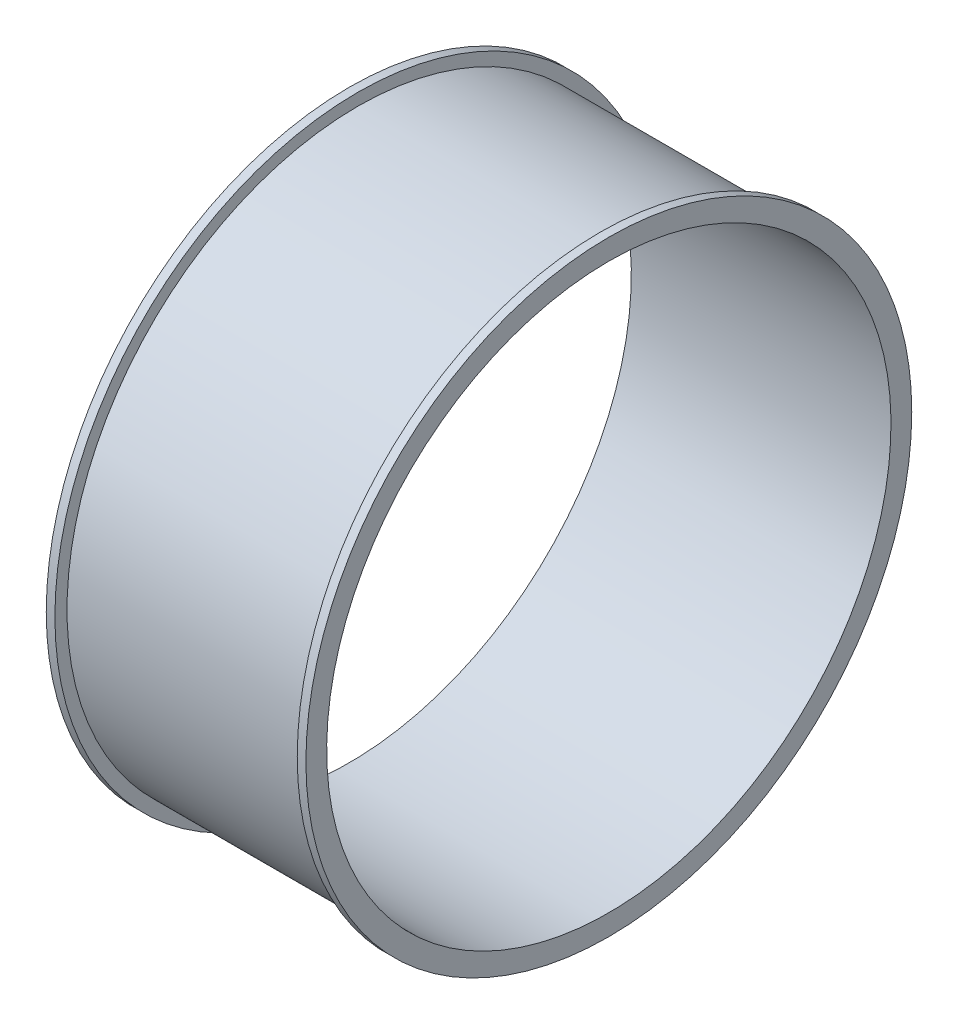
ISO-10303-21;
HEADER;
FILE_DESCRIPTION(('STEP AP214'),'2;1');
FILE_NAME('part.step','',(''),(''),'','','');
FILE_SCHEMA(('AUTOMOTIVE_DESIGN { 1 0 10303 214 1 1 1 1 }'));
ENDSEC;
DATA;
#1=APPLICATION_CONTEXT('core data for automotive mechanical design processes');
#2=APPLICATION_PROTOCOL_DEFINITION('international standard','automotive_design',2000,#1);
#3=PRODUCT_CONTEXT('',#1,'mechanical');
#4=PRODUCT('Part','Part','',(#3));
#5=PRODUCT_RELATED_PRODUCT_CATEGORY('part','',(#4));
#6=PRODUCT_DEFINITION_FORMATION('','',#4);
#7=PRODUCT_DEFINITION_CONTEXT('part definition',#1,'design');
#8=PRODUCT_DEFINITION('design','',#6,#7);
#9=PRODUCT_DEFINITION_SHAPE('','',#8);
#10=(LENGTH_UNIT() NAMED_UNIT(*) SI_UNIT(.MILLI.,.METRE.));
#11=(NAMED_UNIT(*) PLANE_ANGLE_UNIT() SI_UNIT($,.RADIAN.));
#12=(NAMED_UNIT(*) SI_UNIT($,.STERADIAN.) SOLID_ANGLE_UNIT());
#13=UNCERTAINTY_MEASURE_WITH_UNIT(LENGTH_MEASURE(1.E-05),#10,'distance_accuracy_value','');
#14=(GEOMETRIC_REPRESENTATION_CONTEXT(3) GLOBAL_UNCERTAINTY_ASSIGNED_CONTEXT((#13)) GLOBAL_UNIT_ASSIGNED_CONTEXT((#10,
#11,#12)) REPRESENTATION_CONTEXT('',''));
#15=CARTESIAN_POINT('',(0.,0.,0.));
#16=DIRECTION('',(0.,0.,1.));
#17=DIRECTION('',(1.,0.,0.));
#18=AXIS2_PLACEMENT_3D('',#15,#16,#17);
#19=CARTESIAN_POINT('',(0.,0.,0.));
#20=DIRECTION('',(-1.,0.,0.));
#21=DIRECTION('',(0.,0.,1.));
#22=AXIS2_PLACEMENT_3D('',#19,#20,#21);
#23=CYLINDRICAL_SURFACE('',#22,1630.);
#24=CARTESIAN_POINT('',(700.,0.,0.));
#25=DIRECTION('',(-1.,0.,0.));
#26=DIRECTION('',(0.,0.,1.));
#27=AXIS2_PLACEMENT_3D('',#24,#25,#26);
#28=CIRCLE('',#27,1630.);
#29=CARTESIAN_POINT('',(700.,1630.,-1.17027252772837E-05));
#30=VERTEX_POINT('',#29);
#31=CARTESIAN_POINT('',(700.,1630.,0.));
#32=VERTEX_POINT('',#31);
#33=EDGE_CURVE('E11',#30,#32,#28,.T.);
#34=ORIENTED_EDGE('',*,*,#33,.T.);
#35=DIRECTION('',(1.,0.,0.));
#36=VECTOR('',#35,1.);
#37=CARTESIAN_POINT('',(2200.,1630.,0.));
#38=LINE('',#37,#36);
#39=CARTESIAN_POINT('',(2200.,1630.,0.));
#40=VERTEX_POINT('',#39);
#41=EDGE_CURVE('E123',#32,#40,#38,.T.);
#42=ORIENTED_EDGE('',*,*,#41,.T.);
#43=CARTESIAN_POINT('',(2200.,0.,0.));
#44=DIRECTION('',(-1.,0.,0.));
#45=DIRECTION('',(0.,0.,1.));
#46=AXIS2_PLACEMENT_3D('',#43,#44,#45);
#47=CIRCLE('',#46,1630.);
#48=CARTESIAN_POINT('',(2200.,1630.,-1.17027252772837E-05));
#49=VERTEX_POINT('',#48);
#50=EDGE_CURVE('E104',#49,#40,#47,.T.);
#51=ORIENTED_EDGE('',*,*,#50,.F.);
#52=DIRECTION('',(1.,0.,0.));
#53=VECTOR('',#52,1.);
#54=CARTESIAN_POINT('',(2200.,1630.,-1.17027252772837E-05));
#55=LINE('',#54,#53);
#56=EDGE_CURVE('E145',#30,#49,#55,.T.);
#57=ORIENTED_EDGE('',*,*,#56,.F.);
#58=EDGE_LOOP('',(#34,#42,#51,#57));
#59=FACE_BOUND('',#58,.T.);
#60=ADVANCED_FACE('F39',(#59),#23,.F.);
#61=CARTESIAN_POINT('',(700.,1630.,-1.17027252772837E-05));
#62=DIRECTION('',(1.,0.,0.));
#63=DIRECTION('',(0.,0.,-1.));
#64=AXIS2_PLACEMENT_3D('',#61,#62,#63);
#65=PLANE('',#64);
#66=CARTESIAN_POINT('',(700.,0.,0.));
#67=DIRECTION('',(-1.,0.,0.));
#68=DIRECTION('',(0.,0.,1.));
#69=AXIS2_PLACEMENT_3D('',#66,#67,#68);
#70=CIRCLE('',#69,1750.);
#71=CARTESIAN_POINT('',(700.,1750.,-1.25642756044456E-05));
#72=VERTEX_POINT('',#71);
#73=CARTESIAN_POINT('',(700.,1750.,0.));
#74=VERTEX_POINT('',#73);
#75=EDGE_CURVE('E50',#72,#74,#70,.T.);
#76=ORIENTED_EDGE('',*,*,#75,.T.);
#77=DIRECTION('',(0.,-1.,0.));
#78=VECTOR('',#77,1.);
#79=CARTESIAN_POINT('',(700.,1630.,0.));
#80=LINE('',#79,#78);
#81=EDGE_CURVE('E139',#74,#32,#80,.T.);
#82=ORIENTED_EDGE('',*,*,#81,.T.);
#83=ORIENTED_EDGE('',*,*,#33,.F.);
#84=DIRECTION('',(0.,-1.,7.17958605968322E-09));
#85=VECTOR('',#84,1.);
#86=CARTESIAN_POINT('',(700.,1630.,-1.17027252772837E-05));
#87=LINE('',#86,#85);
#88=EDGE_CURVE('E113',#72,#30,#87,.T.);
#89=ORIENTED_EDGE('',*,*,#88,.F.);
#90=EDGE_LOOP('',(#76,#82,#83,#89));
#91=FACE_BOUND('',#90,.T.);
#92=ADVANCED_FACE('F41',(#91),#65,.F.);
#93=CARTESIAN_POINT('',(0.,0.,0.));
#94=DIRECTION('',(-1.,0.,0.));
#95=DIRECTION('',(0.,0.,1.));
#96=AXIS2_PLACEMENT_3D('',#93,#94,#95);
#97=CYLINDRICAL_SURFACE('',#96,1750.);
#98=CARTESIAN_POINT('',(750.,0.,0.));
#99=DIRECTION('',(-1.,0.,0.));
#100=DIRECTION('',(0.,0.,1.));
#101=AXIS2_PLACEMENT_3D('',#98,#99,#100);
#102=CIRCLE('',#101,1750.);
#103=CARTESIAN_POINT('',(750.,1750.,-1.25642756044456E-05));
#104=VERTEX_POINT('',#103);
#105=CARTESIAN_POINT('',(750.,1750.,0.));
#106=VERTEX_POINT('',#105);
#107=EDGE_CURVE('E167',#104,#106,#102,.T.);
#108=ORIENTED_EDGE('',*,*,#107,.T.);
#109=DIRECTION('',(-1.,0.,0.));
#110=VECTOR('',#109,1.);
#111=CARTESIAN_POINT('',(700.,1750.,0.));
#112=LINE('',#111,#110);
#113=EDGE_CURVE('E138',#106,#74,#112,.T.);
#114=ORIENTED_EDGE('',*,*,#113,.T.);
#115=ORIENTED_EDGE('',*,*,#75,.F.);
#116=DIRECTION('',(-1.,0.,0.));
#117=VECTOR('',#116,1.);
#118=CARTESIAN_POINT('',(700.,1750.,-1.25642756044456E-05));
#119=LINE('',#118,#117);
#120=EDGE_CURVE('E160',#104,#72,#119,.T.);
#121=ORIENTED_EDGE('',*,*,#120,.F.);
#122=EDGE_LOOP('',(#108,#114,#115,#121));
#123=FACE_BOUND('',#122,.T.);
#124=ADVANCED_FACE('F170',(#123),#97,.T.);
#125=CARTESIAN_POINT('',(750.,1750.,-1.25642756044456E-05));
#126=DIRECTION('',(-1.,0.,0.));
#127=DIRECTION('',(0.,0.,1.));
#128=AXIS2_PLACEMENT_3D('',#125,#126,#127);
#129=PLANE('',#128);
#130=CARTESIAN_POINT('',(750.,0.,0.));
#131=DIRECTION('',(-1.,0.,0.));
#132=DIRECTION('',(0.,0.,1.));
#133=AXIS2_PLACEMENT_3D('',#130,#131,#132);
#134=CIRCLE('',#133,1680.);
#135=CARTESIAN_POINT('',(750.,1680.,-1.20617045802678E-05));
#136=VERTEX_POINT('',#135);
#137=CARTESIAN_POINT('',(750.,1680.,0.));
#138=VERTEX_POINT('',#137);
#139=EDGE_CURVE('E165',#136,#138,#134,.T.);
#140=ORIENTED_EDGE('',*,*,#139,.T.);
#141=DIRECTION('',(0.,1.,0.));
#142=VECTOR('',#141,1.);
#143=CARTESIAN_POINT('',(750.,1750.,0.));
#144=LINE('',#143,#142);
#145=EDGE_CURVE('E134',#138,#106,#144,.T.);
#146=ORIENTED_EDGE('',*,*,#145,.T.);
#147=ORIENTED_EDGE('',*,*,#107,.F.);
#148=DIRECTION('',(0.,1.,-7.17958605968322E-09));
#149=VECTOR('',#148,1.);
#150=CARTESIAN_POINT('',(750.,1750.,-1.25642756044456E-05));
#151=LINE('',#150,#149);
#152=EDGE_CURVE('E153',#136,#104,#151,.T.);
#153=ORIENTED_EDGE('',*,*,#152,.F.);
#154=EDGE_LOOP('',(#140,#146,#147,#153));
#155=FACE_BOUND('',#154,.T.);
#156=ADVANCED_FACE('F171',(#155),#129,.F.);
#157=CARTESIAN_POINT('',(0.,0.,0.));
#158=DIRECTION('',(-1.,0.,0.));
#159=DIRECTION('',(0.,0.,1.));
#160=AXIS2_PLACEMENT_3D('',#157,#158,#159);
#161=CYLINDRICAL_SURFACE('',#160,1680.);
#162=CARTESIAN_POINT('',(2150.,0.,0.));
#163=DIRECTION('',(-1.,0.,0.));
#164=DIRECTION('',(0.,0.,1.));
#165=AXIS2_PLACEMENT_3D('',#162,#163,#164);
#166=CIRCLE('',#165,1680.);
#167=CARTESIAN_POINT('',(2150.,1680.,-1.20617045802678E-05));
#168=VERTEX_POINT('',#167);
#169=CARTESIAN_POINT('',(2150.,1680.,0.));
#170=VERTEX_POINT('',#169);
#171=EDGE_CURVE('E164',#168,#170,#166,.T.);
#172=ORIENTED_EDGE('',*,*,#171,.T.);
#173=DIRECTION('',(-1.,0.,0.));
#174=VECTOR('',#173,1.);
#175=CARTESIAN_POINT('',(750.,1680.,0.));
#176=LINE('',#175,#174);
#177=EDGE_CURVE('E135',#170,#138,#176,.T.);
#178=ORIENTED_EDGE('',*,*,#177,.T.);
#179=ORIENTED_EDGE('',*,*,#139,.F.);
#180=DIRECTION('',(-1.,0.,0.));
#181=VECTOR('',#180,1.);
#182=CARTESIAN_POINT('',(750.,1680.,-1.20617045802678E-05));
#183=LINE('',#182,#181);
#184=EDGE_CURVE('E151',#168,#136,#183,.T.);
#185=ORIENTED_EDGE('',*,*,#184,.F.);
#186=EDGE_LOOP('',(#172,#178,#179,#185));
#187=FACE_BOUND('',#186,.T.);
#188=ADVANCED_FACE('F180',(#187),#161,.T.);
#189=CARTESIAN_POINT('',(2150.,1680.,-1.20617045802678E-05));
#190=DIRECTION('',(1.,0.,0.));
#191=DIRECTION('',(0.,0.,-1.));
#192=AXIS2_PLACEMENT_3D('',#189,#190,#191);
#193=PLANE('',#192);
#194=CARTESIAN_POINT('',(2150.,0.,0.));
#195=DIRECTION('',(-1.,0.,0.));
#196=DIRECTION('',(0.,0.,1.));
#197=AXIS2_PLACEMENT_3D('',#194,#195,#196);
#198=CIRCLE('',#197,1750.);
#199=CARTESIAN_POINT('',(2150.,1750.,-1.25642756044456E-05));
#200=VERTEX_POINT('',#199);
#201=CARTESIAN_POINT('',(2150.,1750.,0.));
#202=VERTEX_POINT('',#201);
#203=EDGE_CURVE('E161',#200,#202,#198,.T.);
#204=ORIENTED_EDGE('',*,*,#203,.T.);
#205=DIRECTION('',(0.,-1.,0.));
#206=VECTOR('',#205,1.);
#207=CARTESIAN_POINT('',(2150.,1680.,0.));
#208=LINE('',#207,#206);
#209=EDGE_CURVE('E129',#202,#170,#208,.T.);
#210=ORIENTED_EDGE('',*,*,#209,.T.);
#211=ORIENTED_EDGE('',*,*,#171,.F.);
#212=DIRECTION('',(0.,-1.,7.17958605968322E-09));
#213=VECTOR('',#212,1.);
#214=CARTESIAN_POINT('',(2150.,1680.,-1.20617045802678E-05));
#215=LINE('',#214,#213);
#216=EDGE_CURVE('E149',#200,#168,#215,.T.);
#217=ORIENTED_EDGE('',*,*,#216,.F.);
#218=EDGE_LOOP('',(#204,#210,#211,#217));
#219=FACE_BOUND('',#218,.T.);
#220=ADVANCED_FACE('F179',(#219),#193,.F.);
#221=CARTESIAN_POINT('',(0.,0.,0.));
#222=DIRECTION('',(-1.,0.,0.));
#223=DIRECTION('',(0.,0.,1.));
#224=AXIS2_PLACEMENT_3D('',#221,#222,#223);
#225=CYLINDRICAL_SURFACE('',#224,1750.);
#226=CARTESIAN_POINT('',(2200.,0.,0.));
#227=DIRECTION('',(-1.,0.,0.));
#228=DIRECTION('',(0.,0.,1.));
#229=AXIS2_PLACEMENT_3D('',#226,#227,#228);
#230=CIRCLE('',#229,1750.);
#231=CARTESIAN_POINT('',(2200.,1750.,-1.25642756044456E-05));
#232=VERTEX_POINT('',#231);
#233=CARTESIAN_POINT('',(2200.,1750.,0.));
#234=VERTEX_POINT('',#233);
#235=EDGE_CURVE('E114',#232,#234,#230,.T.);
#236=ORIENTED_EDGE('',*,*,#235,.T.);
#237=DIRECTION('',(-1.,0.,0.));
#238=VECTOR('',#237,1.);
#239=CARTESIAN_POINT('',(2150.,1750.,0.));
#240=LINE('',#239,#238);
#241=EDGE_CURVE('E125',#234,#202,#240,.T.);
#242=ORIENTED_EDGE('',*,*,#241,.T.);
#243=ORIENTED_EDGE('',*,*,#203,.F.);
#244=DIRECTION('',(-1.,0.,0.));
#245=VECTOR('',#244,1.);
#246=CARTESIAN_POINT('',(2150.,1750.,-1.25642756044456E-05));
#247=LINE('',#246,#245);
#248=EDGE_CURVE('E144',#232,#200,#247,.T.);
#249=ORIENTED_EDGE('',*,*,#248,.F.);
#250=EDGE_LOOP('',(#236,#242,#243,#249));
#251=FACE_BOUND('',#250,.T.);
#252=ADVANCED_FACE('F183',(#251),#225,.T.);
#253=CARTESIAN_POINT('',(2200.,1750.,-1.25642756044456E-05));
#254=DIRECTION('',(-1.,0.,0.));
#255=DIRECTION('',(0.,0.,1.));
#256=AXIS2_PLACEMENT_3D('',#253,#254,#255);
#257=PLANE('',#256);
#258=DIRECTION('',(0.,1.,-7.17958605968322E-09));
#259=VECTOR('',#258,1.);
#260=CARTESIAN_POINT('',(2200.,1750.,-1.25642756044456E-05));
#261=LINE('',#260,#259);
#262=EDGE_CURVE('E108',#49,#232,#261,.T.);
#263=ORIENTED_EDGE('',*,*,#262,.F.);
#264=ORIENTED_EDGE('',*,*,#50,.T.);
#265=DIRECTION('',(0.,1.,0.));
#266=VECTOR('',#265,1.);
#267=CARTESIAN_POINT('',(2200.,1750.,0.));
#268=LINE('',#267,#266);
#269=EDGE_CURVE('E106',#40,#234,#268,.T.);
#270=ORIENTED_EDGE('',*,*,#269,.T.);
#271=ORIENTED_EDGE('',*,*,#235,.F.);
#272=EDGE_LOOP('',(#263,#264,#270,#271));
#273=FACE_BOUND('',#272,.T.);
#274=ADVANCED_FACE('F103',(#273),#257,.F.);
#275=CARTESIAN_POINT('',(0.,0.,0.));
#276=DIRECTION('',(0.,-7.17958605968322E-09,-1.));
#277=DIRECTION('',(-1.,0.,0.));
#278=AXIS2_PLACEMENT_3D('',#275,#276,#277);
#279=PLANE('',#278);
#280=ORIENTED_EDGE('',*,*,#56,.T.);
#281=ORIENTED_EDGE('',*,*,#262,.T.);
#282=ORIENTED_EDGE('',*,*,#248,.T.);
#283=ORIENTED_EDGE('',*,*,#216,.T.);
#284=ORIENTED_EDGE('',*,*,#184,.T.);
#285=ORIENTED_EDGE('',*,*,#152,.T.);
#286=ORIENTED_EDGE('',*,*,#120,.T.);
#287=ORIENTED_EDGE('',*,*,#88,.T.);
#288=EDGE_LOOP('',(#280,#281,#282,#283,#284,#285,#286,#287));
#289=FACE_BOUND('',#288,.T.);
#290=ADVANCED_FACE('F184',(#289),#279,.F.);
#291=CARTESIAN_POINT('',(0.,0.,0.));
#292=DIRECTION('',(0.,0.,-1.));
#293=DIRECTION('',(-1.,0.,0.));
#294=AXIS2_PLACEMENT_3D('',#291,#292,#293);
#295=PLANE('',#294);
#296=ORIENTED_EDGE('',*,*,#41,.F.);
#297=ORIENTED_EDGE('',*,*,#81,.F.);
#298=ORIENTED_EDGE('',*,*,#113,.F.);
#299=ORIENTED_EDGE('',*,*,#145,.F.);
#300=ORIENTED_EDGE('',*,*,#177,.F.);
#301=ORIENTED_EDGE('',*,*,#209,.F.);
#302=ORIENTED_EDGE('',*,*,#241,.F.);
#303=ORIENTED_EDGE('',*,*,#269,.F.);
#304=EDGE_LOOP('',(#296,#297,#298,#299,#300,#301,#302,#303));
#305=FACE_BOUND('',#304,.T.);
#306=ADVANCED_FACE('F118',(#305),#295,.T.);
#307=CLOSED_SHELL('',(#60,#92,#124,#156,#188,#220,#252,#274,#290,#306));
#308=MANIFOLD_SOLID_BREP('B2',#307);
#309=ADVANCED_BREP_SHAPE_REPRESENTATION('',(#18,#308),#14);
#310=SHAPE_DEFINITION_REPRESENTATION(#9,#309);
ENDSEC;
END-ISO-10303-21;
